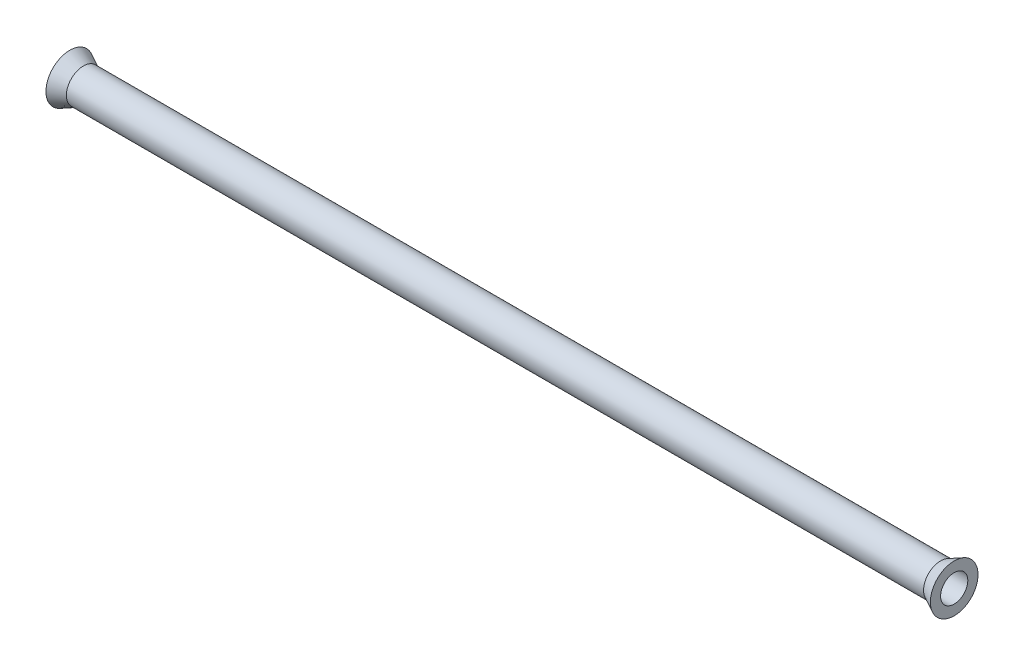
ISO-10303-21;
HEADER;
FILE_DESCRIPTION(('STEP AP214'),'2;1');
FILE_NAME('part.step','',(''),(''),'','','');
FILE_SCHEMA(('AUTOMOTIVE_DESIGN { 1 0 10303 214 1 1 1 1 }'));
ENDSEC;
DATA;
#1=APPLICATION_CONTEXT('core data for automotive mechanical design processes');
#2=APPLICATION_PROTOCOL_DEFINITION('international standard','automotive_design',2000,#1);
#3=PRODUCT_CONTEXT('',#1,'mechanical');
#4=PRODUCT('Part','Part','',(#3));
#5=PRODUCT_RELATED_PRODUCT_CATEGORY('part','',(#4));
#6=PRODUCT_DEFINITION_FORMATION('','',#4);
#7=PRODUCT_DEFINITION_CONTEXT('part definition',#1,'design');
#8=PRODUCT_DEFINITION('design','',#6,#7);
#9=PRODUCT_DEFINITION_SHAPE('','',#8);
#10=(LENGTH_UNIT() NAMED_UNIT(*) SI_UNIT(.MILLI.,.METRE.));
#11=(NAMED_UNIT(*) PLANE_ANGLE_UNIT() SI_UNIT($,.RADIAN.));
#12=(NAMED_UNIT(*) SI_UNIT($,.STERADIAN.) SOLID_ANGLE_UNIT());
#13=UNCERTAINTY_MEASURE_WITH_UNIT(LENGTH_MEASURE(1.E-05),#10,'distance_accuracy_value','');
#14=(GEOMETRIC_REPRESENTATION_CONTEXT(3) GLOBAL_UNCERTAINTY_ASSIGNED_CONTEXT((#13)) GLOBAL_UNIT_ASSIGNED_CONTEXT((#10,
#11,#12)) REPRESENTATION_CONTEXT('',''));
#15=CARTESIAN_POINT('',(0.,0.,0.));
#16=DIRECTION('',(0.,0.,1.));
#17=DIRECTION('',(1.,0.,0.));
#18=AXIS2_PLACEMENT_3D('',#15,#16,#17);
#19=CARTESIAN_POINT('',(0.,6.99999999999997,0.));
#20=DIRECTION('',(1.,0.,0.));
#21=DIRECTION('',(0.,0.,-1.));
#22=AXIS2_PLACEMENT_3D('',#19,#20,#21);
#23=PLANE('',#22);
#24=CARTESIAN_POINT('',(0.,0.,0.));
#25=DIRECTION('',(1.,0.,0.));
#26=DIRECTION('',(0.,0.,-1.));
#27=AXIS2_PLACEMENT_3D('',#24,#25,#26);
#28=CIRCLE('',#27,6.99999999999997);
#29=CARTESIAN_POINT('',(0.,0.,-6.99999999999997));
#30=VERTEX_POINT('',#29);
#31=EDGE_CURVE('E52',#30,#30,#28,.T.);
#32=ORIENTED_EDGE('',*,*,#31,.T.);
#33=EDGE_LOOP('',(#32));
#34=FACE_BOUND('',#33,.T.);
#35=CARTESIAN_POINT('',(0.,0.,0.));
#36=DIRECTION('',(1.,0.,0.));
#37=DIRECTION('',(0.,0.,-1.));
#38=AXIS2_PLACEMENT_3D('',#35,#36,#37);
#39=CIRCLE('',#38,4.);
#40=CARTESIAN_POINT('',(0.,0.,-4.));
#41=VERTEX_POINT('',#40);
#42=EDGE_CURVE('E10',#41,#41,#39,.T.);
#43=ORIENTED_EDGE('',*,*,#42,.F.);
#44=EDGE_LOOP('',(#43));
#45=FACE_BOUND('',#44,.T.);
#46=ADVANCED_FACE('F30',(#34,#45),#23,.T.);
#47=CARTESIAN_POINT('',(0.,0.,0.));
#48=DIRECTION('',(1.,0.,0.));
#49=DIRECTION('',(0.,0.,-1.));
#50=AXIS2_PLACEMENT_3D('',#47,#48,#49);
#51=CYLINDRICAL_SURFACE('',#50,4.);
#52=ORIENTED_EDGE('',*,*,#42,.T.);
#53=EDGE_LOOP('',(#52));
#54=FACE_BOUND('',#53,.T.);
#55=CARTESIAN_POINT('',(-260.,0.,0.));
#56=DIRECTION('',(1.,0.,0.));
#57=DIRECTION('',(0.,0.,-1.));
#58=AXIS2_PLACEMENT_3D('',#55,#56,#57);
#59=CIRCLE('',#58,4.);
#60=CARTESIAN_POINT('',(-260.,0.,-4.));
#61=VERTEX_POINT('',#60);
#62=EDGE_CURVE('E36',#61,#61,#59,.T.);
#63=ORIENTED_EDGE('',*,*,#62,.F.);
#64=EDGE_LOOP('',(#63));
#65=FACE_BOUND('',#64,.T.);
#66=ADVANCED_FACE('F70',(#54,#65),#51,.F.);
#67=CARTESIAN_POINT('',(-260.,6.99999999999997,0.));
#68=DIRECTION('',(-1.,0.,0.));
#69=DIRECTION('',(0.,0.,1.));
#70=AXIS2_PLACEMENT_3D('',#67,#68,#69);
#71=PLANE('',#70);
#72=ORIENTED_EDGE('',*,*,#62,.T.);
#73=EDGE_LOOP('',(#72));
#74=FACE_BOUND('',#73,.T.);
#75=CARTESIAN_POINT('',(-260.,0.,0.));
#76=DIRECTION('',(1.,0.,0.));
#77=DIRECTION('',(0.,0.,-1.));
#78=AXIS2_PLACEMENT_3D('',#75,#76,#77);
#79=CIRCLE('',#78,6.99999999999997);
#80=CARTESIAN_POINT('',(-260.,0.,-6.99999999999997));
#81=VERTEX_POINT('',#80);
#82=EDGE_CURVE('E40',#81,#81,#79,.T.);
#83=ORIENTED_EDGE('',*,*,#82,.F.);
#84=EDGE_LOOP('',(#83));
#85=FACE_BOUND('',#84,.T.);
#86=ADVANCED_FACE('F74',(#74,#85),#71,.T.);
#87=CARTESIAN_POINT('',(-256.,0.,0.));
#88=DIRECTION('',(-1.,0.,0.));
#89=DIRECTION('',(0.,0.,1.));
#90=AXIS2_PLACEMENT_3D('',#87,#88,#89);
#91=CONICAL_SURFACE('',#90,5.,0.463647609000799);
#92=ORIENTED_EDGE('',*,*,#82,.T.);
#93=EDGE_LOOP('',(#92));
#94=FACE_BOUND('',#93,.T.);
#95=CARTESIAN_POINT('',(-256.,0.,0.));
#96=DIRECTION('',(1.,0.,0.));
#97=DIRECTION('',(0.,0.,-1.));
#98=AXIS2_PLACEMENT_3D('',#95,#96,#97);
#99=CIRCLE('',#98,5.);
#100=CARTESIAN_POINT('',(-256.,0.,-5.));
#101=VERTEX_POINT('',#100);
#102=EDGE_CURVE('E44',#101,#101,#99,.T.);
#103=ORIENTED_EDGE('',*,*,#102,.F.);
#104=EDGE_LOOP('',(#103));
#105=FACE_BOUND('',#104,.T.);
#106=ADVANCED_FACE('F66',(#94,#105),#91,.T.);
#107=CARTESIAN_POINT('',(0.,0.,0.));
#108=DIRECTION('',(1.,0.,0.));
#109=DIRECTION('',(0.,0.,-1.));
#110=AXIS2_PLACEMENT_3D('',#107,#108,#109);
#111=CYLINDRICAL_SURFACE('',#110,5.);
#112=ORIENTED_EDGE('',*,*,#102,.T.);
#113=EDGE_LOOP('',(#112));
#114=FACE_BOUND('',#113,.T.);
#115=CARTESIAN_POINT('',(-4.,0.,0.));
#116=DIRECTION('',(1.,0.,0.));
#117=DIRECTION('',(0.,0.,-1.));
#118=AXIS2_PLACEMENT_3D('',#115,#116,#117);
#119=CIRCLE('',#118,5.);
#120=CARTESIAN_POINT('',(-4.,0.,-5.));
#121=VERTEX_POINT('',#120);
#122=EDGE_CURVE('E49',#121,#121,#119,.T.);
#123=ORIENTED_EDGE('',*,*,#122,.F.);
#124=EDGE_LOOP('',(#123));
#125=FACE_BOUND('',#124,.T.);
#126=ADVANCED_FACE('F60',(#114,#125),#111,.T.);
#127=CARTESIAN_POINT('',(0.,0.,0.));
#128=DIRECTION('',(1.,0.,0.));
#129=DIRECTION('',(0.,0.,-1.));
#130=AXIS2_PLACEMENT_3D('',#127,#128,#129);
#131=CONICAL_SURFACE('',#130,6.99999999999997,0.463647609000799);
#132=ORIENTED_EDGE('',*,*,#122,.T.);
#133=EDGE_LOOP('',(#132));
#134=FACE_BOUND('',#133,.T.);
#135=ORIENTED_EDGE('',*,*,#31,.F.);
#136=EDGE_LOOP('',(#135));
#137=FACE_BOUND('',#136,.T.);
#138=ADVANCED_FACE('F58',(#134,#137),#131,.T.);
#139=CLOSED_SHELL('',(#46,#66,#86,#106,#126,#138));
#140=MANIFOLD_SOLID_BREP('B2',#139);
#141=ADVANCED_BREP_SHAPE_REPRESENTATION('',(#18,#140),#14);
#142=SHAPE_DEFINITION_REPRESENTATION(#9,#141);
ENDSEC;
END-ISO-10303-21;
